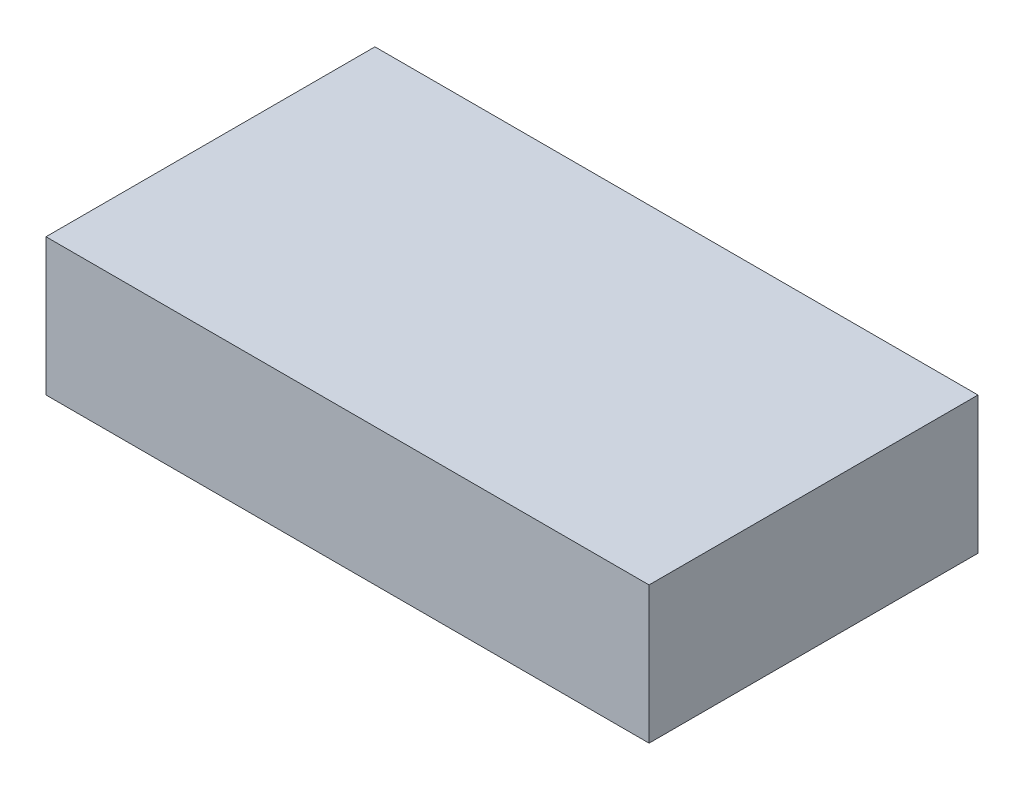
ISO-10303-21;
HEADER;
FILE_DESCRIPTION(('STEP AP214'),'2;1');
FILE_NAME('part.step','',(''),(''),'','','');
FILE_SCHEMA(('AUTOMOTIVE_DESIGN { 1 0 10303 214 1 1 1 1 }'));
ENDSEC;
DATA;
#1=APPLICATION_CONTEXT('core data for automotive mechanical design processes');
#2=APPLICATION_PROTOCOL_DEFINITION('international standard','automotive_design',2000,#1);
#3=PRODUCT_CONTEXT('',#1,'mechanical');
#4=PRODUCT('Part','Part','',(#3));
#5=PRODUCT_RELATED_PRODUCT_CATEGORY('part','',(#4));
#6=PRODUCT_DEFINITION_FORMATION('','',#4);
#7=PRODUCT_DEFINITION_CONTEXT('part definition',#1,'design');
#8=PRODUCT_DEFINITION('design','',#6,#7);
#9=PRODUCT_DEFINITION_SHAPE('','',#8);
#10=(LENGTH_UNIT() NAMED_UNIT(*) SI_UNIT(.MILLI.,.METRE.));
#11=(NAMED_UNIT(*) PLANE_ANGLE_UNIT() SI_UNIT($,.RADIAN.));
#12=(NAMED_UNIT(*) SI_UNIT($,.STERADIAN.) SOLID_ANGLE_UNIT());
#13=UNCERTAINTY_MEASURE_WITH_UNIT(LENGTH_MEASURE(1.E-05),#10,'distance_accuracy_value','');
#14=(GEOMETRIC_REPRESENTATION_CONTEXT(3) GLOBAL_UNCERTAINTY_ASSIGNED_CONTEXT((#13)) GLOBAL_UNIT_ASSIGNED_CONTEXT((#10,
#11,#12)) REPRESENTATION_CONTEXT('',''));
#15=CARTESIAN_POINT('',(0.,0.,0.));
#16=DIRECTION('',(0.,0.,1.));
#17=DIRECTION('',(1.,0.,0.));
#18=AXIS2_PLACEMENT_3D('',#15,#16,#17);
#19=CARTESIAN_POINT('',(-49.5260879954813,5.,50.1236862941856));
#20=DIRECTION('',(1.,0.,0.));
#21=DIRECTION('',(0.,0.,-1.));
#22=AXIS2_PLACEMENT_3D('',#19,#20,#21);
#23=PLANE('',#22);
#24=DIRECTION('',(0.,0.,1.));
#25=VECTOR('',#24,1.);
#26=CARTESIAN_POINT('',(-49.5260879954813,0.,50.1236862941856));
#27=LINE('',#26,#25);
#28=CARTESIAN_POINT('',(-49.5260879954813,0.,50.1236862941856));
#29=VERTEX_POINT('',#28);
#30=CARTESIAN_POINT('',(-49.5260879954813,0.,62.1236862941856));
#31=VERTEX_POINT('',#30);
#32=EDGE_CURVE('E107',#29,#31,#27,.T.);
#33=ORIENTED_EDGE('',*,*,#32,.T.);
#34=DIRECTION('',(0.,-1.,0.));
#35=VECTOR('',#34,1.);
#36=CARTESIAN_POINT('',(-49.5260879954813,5.,62.1236862941856));
#37=LINE('',#36,#35);
#38=CARTESIAN_POINT('',(-49.5260879954813,5.,62.1236862941856));
#39=VERTEX_POINT('',#38);
#40=EDGE_CURVE('E11',#39,#31,#37,.T.);
#41=ORIENTED_EDGE('',*,*,#40,.F.);
#42=DIRECTION('',(0.,0.,1.));
#43=VECTOR('',#42,1.);
#44=CARTESIAN_POINT('',(-49.5260879954813,5.,50.1236862941856));
#45=LINE('',#44,#43);
#46=CARTESIAN_POINT('',(-49.5260879954813,5.,50.1236862941856));
#47=VERTEX_POINT('',#46);
#48=EDGE_CURVE('E91',#47,#39,#45,.T.);
#49=ORIENTED_EDGE('',*,*,#48,.F.);
#50=DIRECTION('',(0.,-1.,0.));
#51=VECTOR('',#50,1.);
#52=CARTESIAN_POINT('',(-49.5260879954813,5.,50.1236862941856));
#53=LINE('',#52,#51);
#54=EDGE_CURVE('E103',#47,#29,#53,.T.);
#55=ORIENTED_EDGE('',*,*,#54,.T.);
#56=EDGE_LOOP('',(#33,#41,#49,#55));
#57=FACE_BOUND('',#56,.T.);
#58=ADVANCED_FACE('F39',(#57),#23,.F.);
#59=CARTESIAN_POINT('',(-49.5260879954813,5.,62.1236862941856));
#60=DIRECTION('',(0.,0.,-1.));
#61=DIRECTION('',(-1.,0.,0.));
#62=AXIS2_PLACEMENT_3D('',#59,#60,#61);
#63=PLANE('',#62);
#64=DIRECTION('',(1.,0.,0.));
#65=VECTOR('',#64,1.);
#66=CARTESIAN_POINT('',(-49.5260879954813,0.,62.1236862941856));
#67=LINE('',#66,#65);
#68=CARTESIAN_POINT('',(-27.5260879954813,0.,62.1236862941856));
#69=VERTEX_POINT('',#68);
#70=EDGE_CURVE('E96',#31,#69,#67,.T.);
#71=ORIENTED_EDGE('',*,*,#70,.T.);
#72=DIRECTION('',(0.,-1.,0.));
#73=VECTOR('',#72,1.);
#74=CARTESIAN_POINT('',(-27.5260879954813,5.,62.1236862941856));
#75=LINE('',#74,#73);
#76=CARTESIAN_POINT('',(-27.5260879954813,5.,62.1236862941856));
#77=VERTEX_POINT('',#76);
#78=EDGE_CURVE('E48',#77,#69,#75,.T.);
#79=ORIENTED_EDGE('',*,*,#78,.F.);
#80=DIRECTION('',(1.,0.,0.));
#81=VECTOR('',#80,1.);
#82=CARTESIAN_POINT('',(-49.5260879954813,5.,62.1236862941856));
#83=LINE('',#82,#81);
#84=EDGE_CURVE('E86',#39,#77,#83,.T.);
#85=ORIENTED_EDGE('',*,*,#84,.F.);
#86=ORIENTED_EDGE('',*,*,#40,.T.);
#87=EDGE_LOOP('',(#71,#79,#85,#86));
#88=FACE_BOUND('',#87,.T.);
#89=ADVANCED_FACE('F95',(#88),#63,.F.);
#90=CARTESIAN_POINT('',(-27.5260879954813,5.,50.1236862941856));
#91=DIRECTION('',(-1.,0.,0.));
#92=DIRECTION('',(0.,0.,1.));
#93=AXIS2_PLACEMENT_3D('',#90,#91,#92);
#94=PLANE('',#93);
#95=DIRECTION('',(0.,0.,-1.));
#96=VECTOR('',#95,1.);
#97=CARTESIAN_POINT('',(-27.5260879954813,0.,50.1236862941856));
#98=LINE('',#97,#96);
#99=CARTESIAN_POINT('',(-27.5260879954813,0.,50.1236862941856));
#100=VERTEX_POINT('',#99);
#101=EDGE_CURVE('E73',#69,#100,#98,.T.);
#102=ORIENTED_EDGE('',*,*,#101,.T.);
#103=DIRECTION('',(0.,-1.,0.));
#104=VECTOR('',#103,1.);
#105=CARTESIAN_POINT('',(-27.5260879954813,5.,50.1236862941856));
#106=LINE('',#105,#104);
#107=CARTESIAN_POINT('',(-27.5260879954813,5.,50.1236862941856));
#108=VERTEX_POINT('',#107);
#109=EDGE_CURVE('E98',#108,#100,#106,.T.);
#110=ORIENTED_EDGE('',*,*,#109,.F.);
#111=DIRECTION('',(0.,0.,-1.));
#112=VECTOR('',#111,1.);
#113=CARTESIAN_POINT('',(-27.5260879954813,5.,50.1236862941856));
#114=LINE('',#113,#112);
#115=EDGE_CURVE('E89',#77,#108,#114,.T.);
#116=ORIENTED_EDGE('',*,*,#115,.F.);
#117=ORIENTED_EDGE('',*,*,#78,.T.);
#118=EDGE_LOOP('',(#102,#110,#116,#117));
#119=FACE_BOUND('',#118,.T.);
#120=ADVANCED_FACE('F99',(#119),#94,.F.);
#121=CARTESIAN_POINT('',(-49.5260879954813,5.,50.1236862941856));
#122=DIRECTION('',(0.,0.,1.));
#123=DIRECTION('',(1.,0.,0.));
#124=AXIS2_PLACEMENT_3D('',#121,#122,#123);
#125=PLANE('',#124);
#126=DIRECTION('',(-1.,0.,0.));
#127=VECTOR('',#126,1.);
#128=CARTESIAN_POINT('',(-49.5260879954813,0.,50.1236862941856));
#129=LINE('',#128,#127);
#130=EDGE_CURVE('E79',#100,#29,#129,.T.);
#131=ORIENTED_EDGE('',*,*,#130,.T.);
#132=ORIENTED_EDGE('',*,*,#54,.F.);
#133=DIRECTION('',(-1.,0.,0.));
#134=VECTOR('',#133,1.);
#135=CARTESIAN_POINT('',(-49.5260879954813,5.,50.1236862941856));
#136=LINE('',#135,#134);
#137=EDGE_CURVE('E56',#108,#47,#136,.T.);
#138=ORIENTED_EDGE('',*,*,#137,.F.);
#139=ORIENTED_EDGE('',*,*,#109,.T.);
#140=EDGE_LOOP('',(#131,#132,#138,#139));
#141=FACE_BOUND('',#140,.T.);
#142=ADVANCED_FACE('F120',(#141),#125,.F.);
#143=CARTESIAN_POINT('',(0.,5.,0.));
#144=DIRECTION('',(0.,1.,0.));
#145=DIRECTION('',(0.,0.,1.));
#146=AXIS2_PLACEMENT_3D('',#143,#144,#145);
#147=PLANE('',#146);
#148=ORIENTED_EDGE('',*,*,#48,.T.);
#149=ORIENTED_EDGE('',*,*,#84,.T.);
#150=ORIENTED_EDGE('',*,*,#115,.T.);
#151=ORIENTED_EDGE('',*,*,#137,.T.);
#152=EDGE_LOOP('',(#148,#149,#150,#151));
#153=FACE_BOUND('',#152,.T.);
#154=ADVANCED_FACE('F87',(#153),#147,.T.);
#155=CARTESIAN_POINT('',(0.,0.,0.));
#156=DIRECTION('',(0.,1.,0.));
#157=DIRECTION('',(0.,0.,1.));
#158=AXIS2_PLACEMENT_3D('',#155,#156,#157);
#159=PLANE('',#158);
#160=ORIENTED_EDGE('',*,*,#32,.F.);
#161=ORIENTED_EDGE('',*,*,#130,.F.);
#162=ORIENTED_EDGE('',*,*,#101,.F.);
#163=ORIENTED_EDGE('',*,*,#70,.F.);
#164=EDGE_LOOP('',(#160,#161,#162,#163));
#165=FACE_BOUND('',#164,.T.);
#166=ADVANCED_FACE('F123',(#165),#159,.F.);
#167=CLOSED_SHELL('',(#58,#89,#120,#142,#154,#166));
#168=MANIFOLD_SOLID_BREP('B2',#167);
#169=ADVANCED_BREP_SHAPE_REPRESENTATION('',(#18,#168),#14);
#170=SHAPE_DEFINITION_REPRESENTATION(#9,#169);
ENDSEC;
END-ISO-10303-21;
